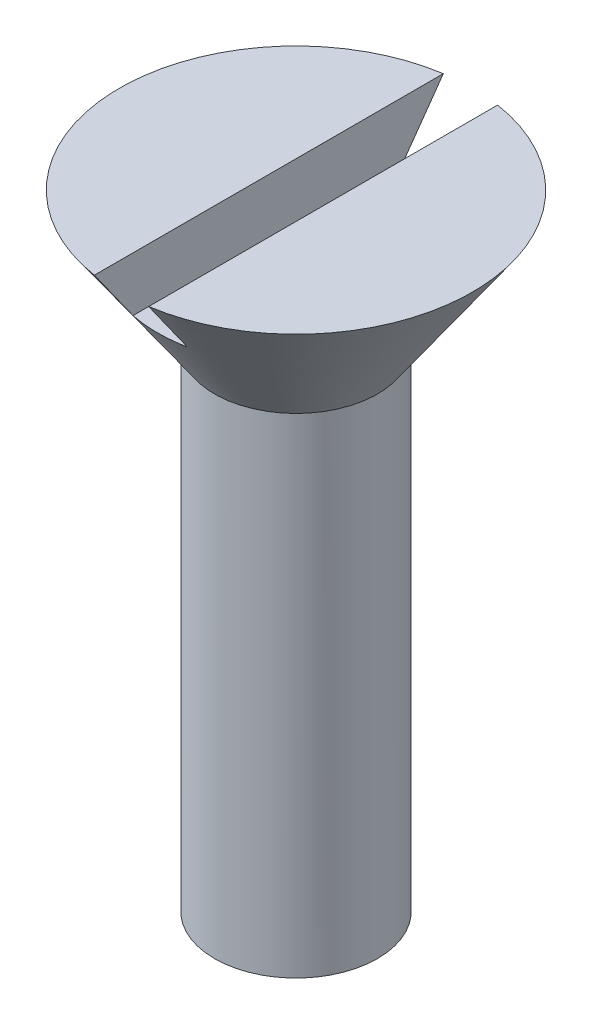
ISO-10303-21;
HEADER;
FILE_DESCRIPTION(('STEP AP214'),'2;1');
FILE_NAME('part.step','',(''),(''),'','','');
FILE_SCHEMA(('AUTOMOTIVE_DESIGN { 1 0 10303 214 1 1 1 1 }'));
ENDSEC;
DATA;
#1=APPLICATION_CONTEXT('core data for automotive mechanical design processes');
#2=APPLICATION_PROTOCOL_DEFINITION('international standard','automotive_design',2000,#1);
#3=PRODUCT_CONTEXT('',#1,'mechanical');
#4=PRODUCT('Part','Part','',(#3));
#5=PRODUCT_RELATED_PRODUCT_CATEGORY('part','',(#4));
#6=PRODUCT_DEFINITION_FORMATION('','',#4);
#7=PRODUCT_DEFINITION_CONTEXT('part definition',#1,'design');
#8=PRODUCT_DEFINITION('design','',#6,#7);
#9=PRODUCT_DEFINITION_SHAPE('','',#8);
#10=(LENGTH_UNIT() NAMED_UNIT(*) SI_UNIT(.MILLI.,.METRE.));
#11=(NAMED_UNIT(*) PLANE_ANGLE_UNIT() SI_UNIT($,.RADIAN.));
#12=(NAMED_UNIT(*) SI_UNIT($,.STERADIAN.) SOLID_ANGLE_UNIT());
#13=UNCERTAINTY_MEASURE_WITH_UNIT(LENGTH_MEASURE(1.E-05),#10,'distance_accuracy_value','');
#14=(GEOMETRIC_REPRESENTATION_CONTEXT(3) GLOBAL_UNCERTAINTY_ASSIGNED_CONTEXT((#13)) GLOBAL_UNIT_ASSIGNED_CONTEXT((#10,
#11,#12)) REPRESENTATION_CONTEXT('',''));
#15=CARTESIAN_POINT('',(0.,0.,0.));
#16=DIRECTION('',(0.,0.,1.));
#17=DIRECTION('',(1.,0.,0.));
#18=AXIS2_PLACEMENT_3D('',#15,#16,#17);
#19=CARTESIAN_POINT('',(0.,0.,0.));
#20=DIRECTION('',(0.,1.,0.));
#21=DIRECTION('',(0.,0.,1.));
#22=AXIS2_PLACEMENT_3D('',#19,#20,#21);
#23=PLANE('',#22);
#24=DIRECTION('',(0.,0.,-1.));
#25=VECTOR('',#24,1.);
#26=CARTESIAN_POINT('',(1.,0.,0.));
#27=LINE('',#26,#25);
#28=CARTESIAN_POINT('',(1.,0.,6.42261628933257));
#29=VERTEX_POINT('',#28);
#30=CARTESIAN_POINT('',(1.,0.,-6.42261628933257));
#31=VERTEX_POINT('',#30);
#32=EDGE_CURVE('E152',#29,#31,#27,.T.);
#33=ORIENTED_EDGE('',*,*,#32,.F.);
#34=CARTESIAN_POINT('',(0.,0.,0.));
#35=DIRECTION('',(0.,-1.,0.));
#36=DIRECTION('',(0.,0.,-1.));
#37=AXIS2_PLACEMENT_3D('',#34,#35,#36);
#38=CIRCLE('',#37,6.50000000000001);
#39=EDGE_CURVE('E113',#31,#29,#38,.T.);
#40=ORIENTED_EDGE('',*,*,#39,.F.);
#41=EDGE_LOOP('',(#33,#40));
#42=FACE_BOUND('',#41,.T.);
#43=ADVANCED_FACE('F39',(#42),#23,.T.);
#44=DIRECTION('',(0.,0.,1.));
#45=VECTOR('',#44,1.);
#46=CARTESIAN_POINT('',(-1.,0.,0.));
#47=LINE('',#46,#45);
#48=CARTESIAN_POINT('',(-1.,0.,-6.42261628933257));
#49=VERTEX_POINT('',#48);
#50=CARTESIAN_POINT('',(-1.,0.,6.42261628933257));
#51=VERTEX_POINT('',#50);
#52=EDGE_CURVE('E87',#49,#51,#47,.T.);
#53=ORIENTED_EDGE('',*,*,#52,.F.);
#54=EDGE_CURVE('E115',#51,#49,#38,.T.);
#55=ORIENTED_EDGE('',*,*,#54,.F.);
#56=EDGE_LOOP('',(#53,#55));
#57=FACE_BOUND('',#56,.T.);
#58=ADVANCED_FACE('F41',(#57),#23,.T.);
#59=CARTESIAN_POINT('',(0.,-5.,0.));
#60=DIRECTION('',(0.,1.,0.));
#61=DIRECTION('',(0.,0.,1.));
#62=AXIS2_PLACEMENT_3D('',#59,#60,#61);
#63=CONICAL_SURFACE('',#62,3.,0.610725964389209);
#64=CARTESIAN_POINT('',(1.,0.0007,-6.4231121927069));
#65=CARTESIAN_POINT('',(1.,-0.250402973210667,-6.24521507547194));
#66=CARTESIAN_POINT('',(1.,-0.501430348754829,-6.06721105785794));
#67=CARTESIAN_POINT('',(1.,-1.00328543473532,-5.71088793330972));
#68=CARTESIAN_POINT('',(1.,-1.25411313141089,-5.53256880699693));
#69=CARTESIAN_POINT('',(1.,-1.75624717314772,-5.17499647886702));
#70=CARTESIAN_POINT('',(1.,-2.00755266877064,-4.99574208349888));
#71=CARTESIAN_POINT('',(1.,-2.50975864588098,-4.63669913452874));
#72=CARTESIAN_POINT('',(1.,-2.76065915109723,-4.45691061411515));
#73=CARTESIAN_POINT('',(1.,-3.32066567942011,-4.05434246098986));
#74=CARTESIAN_POINT('',(1.,-3.62962925783441,-3.83136424535591));
#75=CARTESIAN_POINT('',(1.,-4.09206747695827,-3.49544297230532));
#76=CARTESIAN_POINT('',(1.,-4.2460615110616,-3.38321524822286));
#77=CARTESIAN_POINT('',(1.,-4.55357761222402,-3.15811915839283));
#78=CARTESIAN_POINT('',(1.,-4.70709968602469,-3.04525080186236));
#79=CARTESIAN_POINT('',(1.,-5.01310136529785,-2.81893473483322));
#80=CARTESIAN_POINT('',(1.,-5.16558264221547,-2.70548928810726));
#81=CARTESIAN_POINT('',(1.,-5.4696305535057,-2.47735955209802));
#82=CARTESIAN_POINT('',(1.,-5.62119713375148,-2.36267519060135));
#83=CARTESIAN_POINT('',(1.,-5.92289177437992,-2.13153400820381));
#84=CARTESIAN_POINT('',(1.,-6.07302034770651,-2.01507786083154));
#85=CARTESIAN_POINT('',(1.,-6.29649432515915,-1.83823431248961));
#86=CARTESIAN_POINT('',(1.,-6.37069560583634,-1.77892951008025));
#87=CARTESIAN_POINT('',(1.,-6.51833236747371,-1.65937552484643));
#88=CARTESIAN_POINT('',(1.,-6.59176787191012,-1.59912637111531));
#89=CARTESIAN_POINT('',(1.,-6.71365973362481,-1.49735496061013));
#90=CARTESIAN_POINT('',(1.,-6.76240331660418,-1.45617701216027));
#91=CARTESIAN_POINT('',(1.,-6.85929593016328,-1.37311830533831));
#92=CARTESIAN_POINT('',(1.,-6.90744491465202,-1.33123749306917));
#93=CARTESIAN_POINT('',(1.,-7.00314777347609,-1.24644783826052));
#94=CARTESIAN_POINT('',(1.,-7.05069880836867,-1.20353578171963));
#95=CARTESIAN_POINT('',(1.,-7.14476589149895,-1.11660199553977));
#96=CARTESIAN_POINT('',(1.,-7.19128210747751,-1.07258044824988));
#97=CARTESIAN_POINT('',(1.,-7.28171784528769,-0.984258875571618));
#98=CARTESIAN_POINT('',(1.,-7.32567344502512,-0.939995978319391));
#99=CARTESIAN_POINT('',(1.,-7.41170748248032,-0.849685965186153));
#100=CARTESIAN_POINT('',(1.,-7.45378642200474,-0.803639332492839));
#101=CARTESIAN_POINT('',(1.,-7.5349985797957,-0.709408627074624));
#102=CARTESIAN_POINT('',(1.,-7.5741457763169,-0.661236704334911));
#103=CARTESIAN_POINT('',(1.,-7.64825600880548,-0.561804744039556));
#104=CARTESIAN_POINT('',(1.,-7.68322653705195,-0.510550491890749));
#105=CARTESIAN_POINT('',(1.,-7.72761842246045,-0.43581143221311));
#106=CARTESIAN_POINT('',(1.,-7.73983903465966,-0.413994672182492));
#107=CARTESIAN_POINT('',(1.,-7.76294754857882,-0.369660988832994));
#108=CARTESIAN_POINT('',(1.,-7.77383497797314,-0.347143820893277));
#109=CARTESIAN_POINT('',(1.,-7.80400329022563,-0.278664441259215));
#110=CARTESIAN_POINT('',(1.,-7.8209086427829,-0.231583649581734));
#111=CARTESIAN_POINT('',(1.,-7.84352580818615,-0.143751659910725));
#112=CARTESIAN_POINT('',(1.,-7.8507050039418,-0.103387133416544));
#113=CARTESIAN_POINT('',(1.,-7.85797486648315,-0.0219594036923835));
#114=CARTESIAN_POINT('',(1.,-7.85806047775886,0.0191042769698429));
#115=CARTESIAN_POINT('',(1.,-7.8511205139962,0.100503321516523));
#116=CARTESIAN_POINT('',(1.,-7.84411070636894,0.140840098426752));
#117=CARTESIAN_POINT('',(1.,-7.82406213975652,0.219934025983463));
#118=CARTESIAN_POINT('',(1.,-7.81102230238592,0.258690892735779));
#119=CARTESIAN_POINT('',(1.,-7.78188033002872,0.330465253321088));
#120=CARTESIAN_POINT('',(1.,-7.76621918682466,0.363667547268321));
#121=CARTESIAN_POINT('',(1.,-7.73206005853269,0.428595619012457));
#122=CARTESIAN_POINT('',(1.,-7.71355951008277,0.460320028527873));
#123=CARTESIAN_POINT('',(1.,-7.67433228656221,0.522585950662293));
#124=CARTESIAN_POINT('',(1.,-7.6535940232754,0.553120070167372));
#125=CARTESIAN_POINT('',(1.,-7.61050564213083,0.612996566707758));
#126=CARTESIAN_POINT('',(1.,-7.58815626111847,0.64233947906372));
#127=CARTESIAN_POINT('',(1.,-7.51783485578599,0.730686952033603));
#128=CARTESIAN_POINT('',(1.,-7.46786171803238,0.788092695306648));
#129=CARTESIAN_POINT('',(1.,-7.36473606932232,0.899994752825915));
#130=CARTESIAN_POINT('',(1.,-7.31158074042106,0.954488405025327));
#131=CARTESIAN_POINT('',(1.,-7.2030618120303,1.06149306115469));
#132=CARTESIAN_POINT('',(1.,-7.14769308022233,1.1139988329536));
#133=CARTESIAN_POINT('',(1.,-7.03551697028455,1.21745270602297));
#134=CARTESIAN_POINT('',(1.,-6.97870941712555,1.26840061610316));
#135=CARTESIAN_POINT('',(1.,-6.86363116069688,1.36949512242316));
#136=CARTESIAN_POINT('',(1.,-6.8053526735311,1.41963282838063));
#137=CARTESIAN_POINT('',(1.,-6.68801152965098,1.51898955075175));
#138=CARTESIAN_POINT('',(1.,-6.6289488061991,1.56820848811069));
#139=CARTESIAN_POINT('',(1.,-6.51033141743059,1.66583472159216));
#140=CARTESIAN_POINT('',(1.,-6.45077779885165,1.71424329188762));
#141=CARTESIAN_POINT('',(1.,-6.3312059313073,1.81047784179125));
#142=CARTESIAN_POINT('',(1.,-6.27118769885124,1.85830384194617));
#143=CARTESIAN_POINT('',(1.,-6.0815781597282,2.00819700899558));
#144=CARTESIAN_POINT('',(1.,-5.95131874461284,2.10941865781125));
#145=CARTESIAN_POINT('',(1.,-5.68969473050542,2.31042525016911));
#146=CARTESIAN_POINT('',(1.,-5.55833009681158,2.41021014833132));
#147=CARTESIAN_POINT('',(1.,-5.29482181660968,2.60877175431694));
#148=CARTESIAN_POINT('',(1.,-5.16267809559564,2.70754836316462));
#149=CARTESIAN_POINT('',(1.,-4.89783636936228,2.90435620432973));
#150=CARTESIAN_POINT('',(1.,-4.76513836088276,3.00238743225338));
#151=CARTESIAN_POINT('',(1.,-4.36613967246594,3.29586613365336));
#152=CARTESIAN_POINT('',(1.,-4.09922627089917,3.4904801154274));
#153=CARTESIAN_POINT('',(1.,-3.56444630719684,3.87835826017652));
#154=CARTESIAN_POINT('',(1.,-3.29657980020394,4.07162249938513));
#155=CARTESIAN_POINT('',(1.,-2.77654815539002,4.44551854449073));
#156=CARTESIAN_POINT('',(1.,-2.52442061432675,4.62620266343094));
#157=CARTESIAN_POINT('',(1.,-2.0197670589774,4.98702305613862));
#158=CARTESIAN_POINT('',(1.,-1.76724103743862,5.16715931975581));
#159=CARTESIAN_POINT('',(1.,-1.2622650319287,5.52677185493383));
#160=CARTESIAN_POINT('',(1.,-1.00981545797446,5.70624870244839));
#161=CARTESIAN_POINT('',(1.,-0.504702660936669,6.06489037383144));
#162=CARTESIAN_POINT('',(1.,-0.252039442419041,6.24405520412978));
#163=CARTESIAN_POINT('',(1.,0.000700000000000278,6.4231121927069));
#164=B_SPLINE_CURVE_WITH_KNOTS('',3,(#64,#65,#66,#67,#68,#69,#70,#71,#72,#73,#74,#75,#76,#77,
#78,#79,#80,#81,#82,#83,#84,#85,#86,#87,#88,#89,#90,#91,#92,#93,#94,#95,#96,#97,#98,#99,#100,
#101,#102,#103,#104,#105,#106,#107,#108,#109,#110,#111,#112,#113,#114,#115,#116,#117,#118,#119,
#120,#121,#122,#123,#124,#125,#126,#127,#128,#129,#130,#131,#132,#133,#134,#135,#136,#137,#138,
#139,#140,#141,#142,#143,#144,#145,#146,#147,#148,#149,#150,#151,#152,#153,#154,#155,#156,#157,
#158,#159,#160,#161,#162,#163),.UNSPECIFIED.,.F.,.F.,(4,2,2,2,2,2,2,2,2,2,2,2,2,2,2,2,2,2,2,2,2,
2,2,2,2,2,2,2,2,2,2,2,2,2,2,2,2,2,2,2,2,2,2,2,2,2,2,2,2,4),(0.,0.923201509240995,
1.84646192008956,2.77251707641884,3.69851584706989,4.84157654201852,5.41322473304255,
5.98486472022839,6.55502115896762,7.12521101202564,7.69518927526241,7.98015070767564,
8.26510337825439,8.45652467666824,8.64796072134151,8.84010072326167,9.03220934955082,
9.2193134976021,9.40636731153534,9.59246346676998,9.77822061490547,9.85319794763916,
9.92820176727316,10.0775406581727,10.1999903842997,10.3225273780829,10.4447926671675,
10.5670798301291,10.6770443346272,10.7871087034044,10.8977732132442,11.0083874278571,
11.2364917496226,11.4648011428321,11.6936747166946,11.9225762674854,12.1531967152284,
12.3838369158942,12.6140718598639,12.844298660001,13.3391746463811,13.8340662293547,
14.3290059335492,14.8239485529879,15.8149277270123,16.8058504703305,17.7364058749223,
18.6669784163907,19.5962168450814,20.5254358925289),.UNSPECIFIED.);
#165=CARTESIAN_POINT('',(1.,-2.,5.00099990002));
#166=VERTEX_POINT('',#165);
#167=EDGE_CURVE('E11',#166,#29,#164,.T.);
#168=ORIENTED_EDGE('',*,*,#167,.F.);
#169=CARTESIAN_POINT('',(0.,-2.,0.));
#170=DIRECTION('',(0.,-1.,0.));
#171=DIRECTION('',(0.,0.,-1.));
#172=AXIS2_PLACEMENT_3D('',#169,#170,#171);
#173=CIRCLE('',#172,5.1);
#174=CARTESIAN_POINT('',(-1.,-2.,5.00099990002));
#175=VERTEX_POINT('',#174);
#176=EDGE_CURVE('E54',#175,#166,#173,.F.);
#177=ORIENTED_EDGE('',*,*,#176,.F.);
#178=CARTESIAN_POINT('',(-1.,0.0007,6.4231121927069));
#179=CARTESIAN_POINT('',(-1.,-0.250402973210667,6.24521507547194));
#180=CARTESIAN_POINT('',(-1.,-0.501430348754829,6.06721105785794));
#181=CARTESIAN_POINT('',(-1.,-1.00328543473533,5.71088793330972));
#182=CARTESIAN_POINT('',(-1.,-1.25411313141089,5.53256880699693));
#183=CARTESIAN_POINT('',(-1.,-1.75624717314772,5.17499647886702));
#184=CARTESIAN_POINT('',(-1.,-2.00755266877064,4.99574208349888));
#185=CARTESIAN_POINT('',(-1.,-2.50975864588098,4.63669913452874));
#186=CARTESIAN_POINT('',(-1.,-2.76065915109723,4.45691061411515));
#187=CARTESIAN_POINT('',(-1.,-3.32066567942011,4.05434246098986));
#188=CARTESIAN_POINT('',(-1.,-3.62962925783442,3.8313642453559));
#189=CARTESIAN_POINT('',(-1.,-4.09206747695828,3.49544297230532));
#190=CARTESIAN_POINT('',(-1.,-4.2460615110616,3.38321524822285));
#191=CARTESIAN_POINT('',(-1.,-4.55357761222402,3.15811915839283));
#192=CARTESIAN_POINT('',(-1.,-4.7070996860247,3.04525080186235));
#193=CARTESIAN_POINT('',(-1.,-5.01310136529785,2.81893473483322));
#194=CARTESIAN_POINT('',(-1.,-5.16558264221547,2.70548928810726));
#195=CARTESIAN_POINT('',(-1.,-5.4696305535057,2.47735955209801));
#196=CARTESIAN_POINT('',(-1.,-5.62119713375149,2.36267519060134));
#197=CARTESIAN_POINT('',(-1.,-5.92289177437992,2.13153400820381));
#198=CARTESIAN_POINT('',(-1.,-6.07302034770651,2.01507786083153));
#199=CARTESIAN_POINT('',(-1.,-6.29649432515916,1.83823431248961));
#200=CARTESIAN_POINT('',(-1.,-6.37069560583634,1.77892951008025));
#201=CARTESIAN_POINT('',(-1.,-6.51833236747371,1.65937552484642));
#202=CARTESIAN_POINT('',(-1.,-6.59176787191012,1.59912637111531));
#203=CARTESIAN_POINT('',(-1.,-6.71365973362481,1.49735496061013));
#204=CARTESIAN_POINT('',(-1.,-6.76240331660418,1.45617701216027));
#205=CARTESIAN_POINT('',(-1.,-6.85929593016328,1.37311830533831));
#206=CARTESIAN_POINT('',(-1.,-6.90744491465202,1.33123749306917));
#207=CARTESIAN_POINT('',(-1.,-7.00314777347609,1.24644783826052));
#208=CARTESIAN_POINT('',(-1.,-7.05069880836867,1.20353578171963));
#209=CARTESIAN_POINT('',(-1.,-7.14476589149895,1.11660199553977));
#210=CARTESIAN_POINT('',(-1.,-7.19128210747751,1.07258044824988));
#211=CARTESIAN_POINT('',(-1.,-7.28171784528769,0.984258875571617));
#212=CARTESIAN_POINT('',(-1.,-7.32567344502512,0.93999597831939));
#213=CARTESIAN_POINT('',(-1.,-7.41170748248032,0.849685965186152));
#214=CARTESIAN_POINT('',(-1.,-7.45378642200474,0.803639332492838));
#215=CARTESIAN_POINT('',(-1.,-7.5349985797957,0.709408627074623));
#216=CARTESIAN_POINT('',(-1.,-7.5741457763169,0.66123670433491));
#217=CARTESIAN_POINT('',(-1.,-7.64825600880548,0.561804744039554));
#218=CARTESIAN_POINT('',(-1.,-7.68322653705195,0.510550491890747));
#219=CARTESIAN_POINT('',(-1.,-7.72761842246045,0.435811432213108));
#220=CARTESIAN_POINT('',(-1.,-7.73983903465966,0.41399467218249));
#221=CARTESIAN_POINT('',(-1.,-7.76294754857882,0.369660988832992));
#222=CARTESIAN_POINT('',(-1.,-7.77383497797314,0.347143820893274));
#223=CARTESIAN_POINT('',(-1.,-7.80400329022563,0.278664441259212));
#224=CARTESIAN_POINT('',(-1.,-7.82090864278289,0.231583649581731));
#225=CARTESIAN_POINT('',(-1.,-7.84352580818615,0.143751659910724));
#226=CARTESIAN_POINT('',(-1.,-7.8507050039418,0.103387133416542));
#227=CARTESIAN_POINT('',(-1.,-7.85797486648314,0.021959403692382));
#228=CARTESIAN_POINT('',(-1.,-7.85806047775886,-0.0191042769698443));
#229=CARTESIAN_POINT('',(-1.,-7.8511205139962,-0.100503321516524));
#230=CARTESIAN_POINT('',(-1.,-7.84411070636893,-0.140840098426752));
#231=CARTESIAN_POINT('',(-1.,-7.82406213975652,-0.219934025983464));
#232=CARTESIAN_POINT('',(-1.,-7.81102230238592,-0.25869089273578));
#233=CARTESIAN_POINT('',(-1.,-7.78188033002872,-0.33046525332109));
#234=CARTESIAN_POINT('',(-1.,-7.76621918682466,-0.363667547268324));
#235=CARTESIAN_POINT('',(-1.,-7.73206005853269,-0.428595619012459));
#236=CARTESIAN_POINT('',(-1.,-7.71355951008277,-0.460320028527875));
#237=CARTESIAN_POINT('',(-1.,-7.67433228656221,-0.522585950662294));
#238=CARTESIAN_POINT('',(-1.,-7.65359402327539,-0.553120070167373));
#239=CARTESIAN_POINT('',(-1.,-7.61050564213083,-0.61299656670776));
#240=CARTESIAN_POINT('',(-1.,-7.58815626111846,-0.642339479063723));
#241=CARTESIAN_POINT('',(-1.,-7.51783485578598,-0.730686952033607));
#242=CARTESIAN_POINT('',(-1.,-7.46786171803237,-0.788092695306653));
#243=CARTESIAN_POINT('',(-1.,-7.36473606932231,-0.89999475282592));
#244=CARTESIAN_POINT('',(-1.,-7.31158074042105,-0.954488405025332));
#245=CARTESIAN_POINT('',(-1.,-7.20306181203029,-1.06149306115469));
#246=CARTESIAN_POINT('',(-1.,-7.14769308022232,-1.11399883295361));
#247=CARTESIAN_POINT('',(-1.,-7.03551697028454,-1.21745270602297));
#248=CARTESIAN_POINT('',(-1.,-6.97870941712554,-1.26840061610317));
#249=CARTESIAN_POINT('',(-1.,-6.86363116069687,-1.36949512242317));
#250=CARTESIAN_POINT('',(-1.,-6.80535267353109,-1.41963282838064));
#251=CARTESIAN_POINT('',(-1.,-6.68801152965097,-1.51898955075175));
#252=CARTESIAN_POINT('',(-1.,-6.62894880619909,-1.5682084881107));
#253=CARTESIAN_POINT('',(-1.,-6.51033141743058,-1.66583472159217));
#254=CARTESIAN_POINT('',(-1.,-6.45077779885164,-1.71424329188763));
#255=CARTESIAN_POINT('',(-1.,-6.33120593130729,-1.81047784179126));
#256=CARTESIAN_POINT('',(-1.,-6.27118769885122,-1.85830384194618));
#257=CARTESIAN_POINT('',(-1.,-6.08157815972818,-2.00819700899559));
#258=CARTESIAN_POINT('',(-1.,-5.95131874461282,-2.10941865781126));
#259=CARTESIAN_POINT('',(-1.,-5.6896947305054,-2.31042525016912));
#260=CARTESIAN_POINT('',(-1.,-5.55833009681157,-2.41021014833133));
#261=CARTESIAN_POINT('',(-1.,-5.29482181660967,-2.60877175431695));
#262=CARTESIAN_POINT('',(-1.,-5.16267809559563,-2.70754836316463));
#263=CARTESIAN_POINT('',(-1.,-4.89783636936227,-2.90435620432973));
#264=CARTESIAN_POINT('',(-1.,-4.76513836088276,-3.00238743225339));
#265=CARTESIAN_POINT('',(-1.,-4.36613967246594,-3.29586613365336));
#266=CARTESIAN_POINT('',(-1.,-4.09922627089917,-3.4904801154274));
#267=CARTESIAN_POINT('',(-1.,-3.56444630719684,-3.87835826017651));
#268=CARTESIAN_POINT('',(-1.,-3.29657980020395,-4.07162249938513));
#269=CARTESIAN_POINT('',(-1.,-2.77654815539002,-4.44551854449072));
#270=CARTESIAN_POINT('',(-1.,-2.52442061432676,-4.62620266343094));
#271=CARTESIAN_POINT('',(-1.,-2.0197670589774,-4.98702305613861));
#272=CARTESIAN_POINT('',(-1.,-1.76724103743863,-5.16715931975581));
#273=CARTESIAN_POINT('',(-1.,-1.2622650319287,-5.52677185493383));
#274=CARTESIAN_POINT('',(-1.,-1.00981545797447,-5.70624870244839));
#275=CARTESIAN_POINT('',(-1.,-0.504702660936671,-6.06489037383144));
#276=CARTESIAN_POINT('',(-1.,-0.252039442419043,-6.24405520412978));
#277=CARTESIAN_POINT('',(-1.,0.000699999999999764,-6.4231121927069));
#278=B_SPLINE_CURVE_WITH_KNOTS('',3,(#178,#179,#180,#181,#182,#183,#184,#185,#186,#187,#188,
#189,#190,#191,#192,#193,#194,#195,#196,#197,#198,#199,#200,#201,#202,#203,#204,#205,#206,#207,
#208,#209,#210,#211,#212,#213,#214,#215,#216,#217,#218,#219,#220,#221,#222,#223,#224,#225,#226,
#227,#228,#229,#230,#231,#232,#233,#234,#235,#236,#237,#238,#239,#240,#241,#242,#243,#244,#245,
#246,#247,#248,#249,#250,#251,#252,#253,#254,#255,#256,#257,#258,#259,#260,#261,#262,#263,#264,
#265,#266,#267,#268,#269,#270,#271,#272,#273,#274,#275,#276,#277),.UNSPECIFIED.,.F.,.F.,(4,2,2,
2,2,2,2,2,2,2,2,2,2,2,2,2,2,2,2,2,2,2,2,2,2,2,2,2,2,2,2,2,2,2,2,2,2,2,2,2,2,2,2,2,2,2,2,2,2,4),
(0.,0.923201509240996,1.84646192008956,2.77251707641884,3.6985158470699,4.84157654201852,
5.41322473304256,5.98486472022839,6.55502115896763,7.12521101202565,7.69518927526241,
7.98015070767564,8.26510337825439,8.45652467666823,8.64796072134151,8.84010072326167,
9.03220934955081,9.2193134976021,9.40636731153534,9.59246346676998,9.77822061490547,
9.85319794763916,9.92820176727316,10.0775406581727,10.1999903842997,10.3225273780829,
10.4447926671675,10.5670798301291,10.6770443346272,10.7871087034044,10.8977732132442,
11.0083874278571,11.2364917496226,11.4648011428321,11.6936747166946,11.9225762674854,
12.1531967152284,12.3838369158942,12.6140718598639,12.844298660001,13.3391746463811,
13.8340662293547,14.3290059335492,14.8239485529879,15.8149277270123,16.8058504703305,
17.7364058749223,18.6669784163907,19.5962168450814,20.5254358925289),.UNSPECIFIED.);
#279=EDGE_CURVE('E84',#51,#175,#278,.T.);
#280=ORIENTED_EDGE('',*,*,#279,.F.);
#281=ORIENTED_EDGE('',*,*,#54,.T.);
#282=CARTESIAN_POINT('',(-1.,-2.,-5.00099990002));
#283=VERTEX_POINT('',#282);
#284=EDGE_CURVE('E94',#283,#49,#278,.T.);
#285=ORIENTED_EDGE('',*,*,#284,.F.);
#286=CARTESIAN_POINT('',(1.,-2.,-5.00099990002));
#287=VERTEX_POINT('',#286);
#288=EDGE_CURVE('E100',#287,#283,#173,.F.);
#289=ORIENTED_EDGE('',*,*,#288,.F.);
#290=EDGE_CURVE('E43',#31,#287,#164,.T.);
#291=ORIENTED_EDGE('',*,*,#290,.F.);
#292=ORIENTED_EDGE('',*,*,#39,.T.);
#293=EDGE_LOOP('',(#168,#177,#280,#281,#285,#289,#291,#292));
#294=FACE_BOUND('',#293,.T.);
#295=CARTESIAN_POINT('',(0.,-5.,0.));
#296=DIRECTION('',(0.,-1.,0.));
#297=DIRECTION('',(0.,0.,-1.));
#298=AXIS2_PLACEMENT_3D('',#295,#296,#297);
#299=CIRCLE('',#298,3.);
#300=CARTESIAN_POINT('',(0.,-5.,-3.));
#301=VERTEX_POINT('',#300);
#302=EDGE_CURVE('E164',#301,#301,#299,.T.);
#303=ORIENTED_EDGE('',*,*,#302,.F.);
#304=EDGE_LOOP('',(#303));
#305=FACE_BOUND('',#304,.T.);
#306=ADVANCED_FACE('F106',(#294,#305),#63,.T.);
#307=CARTESIAN_POINT('',(0.,-24.7320508075689,0.));
#308=DIRECTION('',(0.,-1.,0.));
#309=DIRECTION('',(0.,0.,-1.));
#310=AXIS2_PLACEMENT_3D('',#307,#308,#309);
#311=CYLINDRICAL_SURFACE('',#310,3.);
#312=ORIENTED_EDGE('',*,*,#302,.T.);
#313=EDGE_LOOP('',(#312));
#314=FACE_BOUND('',#313,.T.);
#315=CARTESIAN_POINT('',(0.,-23.,0.));
#316=DIRECTION('',(0.,-1.,0.));
#317=DIRECTION('',(0.,0.,-1.));
#318=AXIS2_PLACEMENT_3D('',#315,#316,#317);
#319=CIRCLE('',#318,3.);
#320=CARTESIAN_POINT('',(0.,-23.,-3.));
#321=VERTEX_POINT('',#320);
#322=EDGE_CURVE('E155',#321,#321,#319,.T.);
#323=ORIENTED_EDGE('',*,*,#322,.F.);
#324=EDGE_LOOP('',(#323));
#325=FACE_BOUND('',#324,.T.);
#326=ADVANCED_FACE('F135',(#314,#325),#311,.T.);
#327=CARTESIAN_POINT('',(0.,-24.7320508075689,0.));
#328=DIRECTION('',(0.,1.,0.));
#329=DIRECTION('',(0.,0.,1.));
#330=AXIS2_PLACEMENT_3D('',#327,#328,#329);
#331=CONICAL_SURFACE('',#330,0.,1.04719755119659);
#332=ORIENTED_EDGE('',*,*,#322,.T.);
#333=EDGE_LOOP('',(#332));
#334=FACE_BOUND('',#333,.T.);
#335=CARTESIAN_POINT('',(0.,-24.7320508075689,0.));
#336=VERTEX_POINT('',#335);
#337=VERTEX_LOOP('',#336);
#338=FACE_BOUND('',#337,.T.);
#339=ADVANCED_FACE('F132',(#334,#338),#331,.T.);
#340=CARTESIAN_POINT('',(1.,2.,-8.));
#341=DIRECTION('',(1.,0.,0.));
#342=DIRECTION('',(0.,0.,-1.));
#343=AXIS2_PLACEMENT_3D('',#340,#341,#342);
#344=PLANE('',#343);
#345=ORIENTED_EDGE('',*,*,#290,.T.);
#346=DIRECTION('',(0.,0.,1.));
#347=VECTOR('',#346,1.);
#348=CARTESIAN_POINT('',(1.,-2.,-8.));
#349=LINE('',#348,#347);
#350=EDGE_CURVE('E103',#287,#166,#349,.T.);
#351=ORIENTED_EDGE('',*,*,#350,.T.);
#352=ORIENTED_EDGE('',*,*,#167,.T.);
#353=ORIENTED_EDGE('',*,*,#32,.T.);
#354=EDGE_LOOP('',(#345,#351,#352,#353));
#355=FACE_BOUND('',#354,.T.);
#356=ADVANCED_FACE('F128',(#355),#344,.F.);
#357=CARTESIAN_POINT('',(-1.,-2.,-8.));
#358=DIRECTION('',(0.,-1.,0.));
#359=DIRECTION('',(0.,0.,-1.));
#360=AXIS2_PLACEMENT_3D('',#357,#358,#359);
#361=PLANE('',#360);
#362=ORIENTED_EDGE('',*,*,#176,.T.);
#363=ORIENTED_EDGE('',*,*,#350,.F.);
#364=ORIENTED_EDGE('',*,*,#288,.T.);
#365=DIRECTION('',(0.,0.,1.));
#366=VECTOR('',#365,1.);
#367=CARTESIAN_POINT('',(-1.,-2.,-8.));
#368=LINE('',#367,#366);
#369=EDGE_CURVE('E61',#283,#175,#368,.T.);
#370=ORIENTED_EDGE('',*,*,#369,.T.);
#371=EDGE_LOOP('',(#362,#363,#364,#370));
#372=FACE_BOUND('',#371,.T.);
#373=ADVANCED_FACE('F96',(#372),#361,.F.);
#374=CARTESIAN_POINT('',(-0.999999999999999,2.,-8.));
#375=DIRECTION('',(-1.,0.,0.));
#376=DIRECTION('',(0.,-1.,0.));
#377=AXIS2_PLACEMENT_3D('',#374,#375,#376);
#378=PLANE('',#377);
#379=ORIENTED_EDGE('',*,*,#279,.T.);
#380=ORIENTED_EDGE('',*,*,#369,.F.);
#381=ORIENTED_EDGE('',*,*,#284,.T.);
#382=ORIENTED_EDGE('',*,*,#52,.T.);
#383=EDGE_LOOP('',(#379,#380,#381,#382));
#384=FACE_BOUND('',#383,.T.);
#385=ADVANCED_FACE('F85',(#384),#378,.F.);
#386=CLOSED_SHELL('',(#43,#58,#306,#326,#339,#356,#373,#385));
#387=MANIFOLD_SOLID_BREP('B2',#386);
#388=ADVANCED_BREP_SHAPE_REPRESENTATION('',(#18,#387),#14);
#389=SHAPE_DEFINITION_REPRESENTATION(#9,#388);
ENDSEC;
END-ISO-10303-21;
